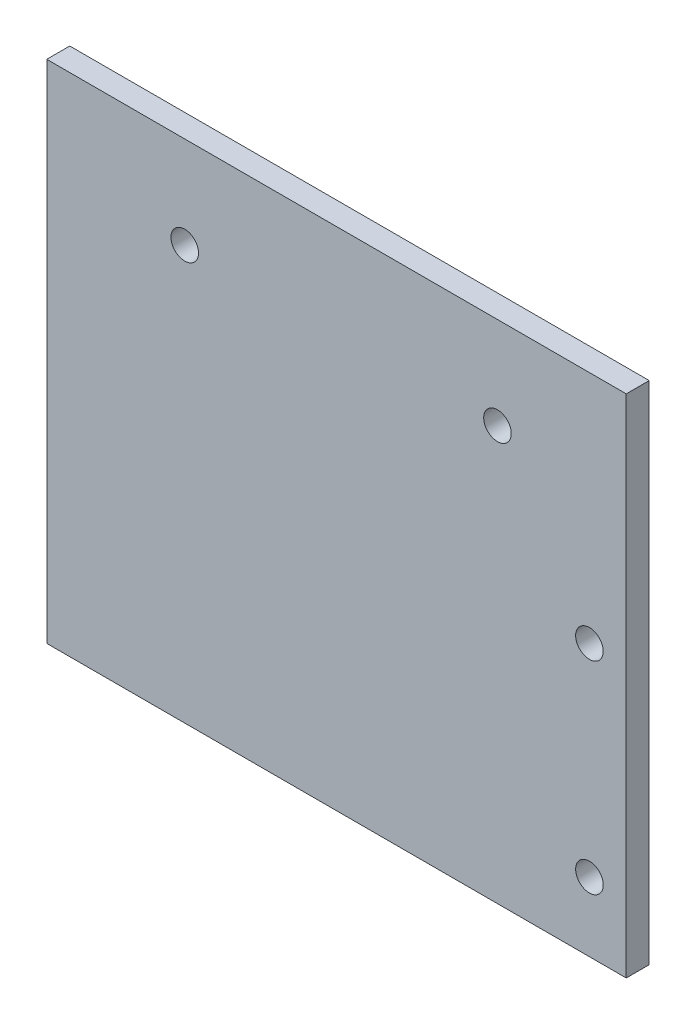
ISO-10303-21;
HEADER;
FILE_DESCRIPTION(('STEP AP214'),'2;1');
FILE_NAME('part.step','',(''),(''),'','','');
FILE_SCHEMA(('AUTOMOTIVE_DESIGN { 1 0 10303 214 1 1 1 1 }'));
ENDSEC;
DATA;
#1=APPLICATION_CONTEXT('core data for automotive mechanical design processes');
#2=APPLICATION_PROTOCOL_DEFINITION('international standard','automotive_design',2000,#1);
#3=PRODUCT_CONTEXT('',#1,'mechanical');
#4=PRODUCT('Part','Part','',(#3));
#5=PRODUCT_RELATED_PRODUCT_CATEGORY('part','',(#4));
#6=PRODUCT_DEFINITION_FORMATION('','',#4);
#7=PRODUCT_DEFINITION_CONTEXT('part definition',#1,'design');
#8=PRODUCT_DEFINITION('design','',#6,#7);
#9=PRODUCT_DEFINITION_SHAPE('','',#8);
#10=(LENGTH_UNIT() NAMED_UNIT(*) SI_UNIT(.MILLI.,.METRE.));
#11=(NAMED_UNIT(*) PLANE_ANGLE_UNIT() SI_UNIT($,.RADIAN.));
#12=(NAMED_UNIT(*) SI_UNIT($,.STERADIAN.) SOLID_ANGLE_UNIT());
#13=UNCERTAINTY_MEASURE_WITH_UNIT(LENGTH_MEASURE(1.E-05),#10,'distance_accuracy_value','');
#14=(GEOMETRIC_REPRESENTATION_CONTEXT(3) GLOBAL_UNCERTAINTY_ASSIGNED_CONTEXT((#13)) GLOBAL_UNIT_ASSIGNED_CONTEXT((#10,
#11,#12)) REPRESENTATION_CONTEXT('',''));
#15=CARTESIAN_POINT('',(0.,0.,0.));
#16=DIRECTION('',(0.,0.,1.));
#17=DIRECTION('',(1.,0.,0.));
#18=AXIS2_PLACEMENT_3D('',#15,#16,#17);
#19=CARTESIAN_POINT('',(0.,0.,2.5));
#20=DIRECTION('',(0.,0.,1.));
#21=DIRECTION('',(1.,0.,0.));
#22=AXIS2_PLACEMENT_3D('',#19,#20,#21);
#23=PLANE('',#22);
#24=CARTESIAN_POINT('',(77.5,-67.5,2.5));
#25=DIRECTION('',(0.,0.,-1.));
#26=DIRECTION('',(-1.,0.,0.));
#27=AXIS2_PLACEMENT_3D('',#24,#25,#26);
#28=CIRCLE('',#27,1.5);
#29=CARTESIAN_POINT('',(76.,-67.5,2.5));
#30=VERTEX_POINT('',#29);
#31=EDGE_CURVE('E123',#30,#30,#28,.T.);
#32=ORIENTED_EDGE('',*,*,#31,.T.);
#33=EDGE_LOOP('',(#32));
#34=FACE_BOUND('',#33,.T.);
#35=CARTESIAN_POINT('',(77.5,-45.5,2.5));
#36=DIRECTION('',(0.,0.,-1.));
#37=DIRECTION('',(-1.,0.,0.));
#38=AXIS2_PLACEMENT_3D('',#35,#36,#37);
#39=CIRCLE('',#38,1.5);
#40=CARTESIAN_POINT('',(76.,-45.5,2.5));
#41=VERTEX_POINT('',#40);
#42=EDGE_CURVE('E132',#41,#41,#39,.T.);
#43=ORIENTED_EDGE('',*,*,#42,.T.);
#44=EDGE_LOOP('',(#43));
#45=FACE_BOUND('',#44,.T.);
#46=CARTESIAN_POINT('',(67.5,-30.,2.5));
#47=DIRECTION('',(0.,0.,-1.));
#48=DIRECTION('',(-1.,0.,0.));
#49=AXIS2_PLACEMENT_3D('',#46,#47,#48);
#50=CIRCLE('',#49,1.5);
#51=CARTESIAN_POINT('',(66.,-30.,2.5));
#52=VERTEX_POINT('',#51);
#53=EDGE_CURVE('E140',#52,#52,#50,.T.);
#54=ORIENTED_EDGE('',*,*,#53,.T.);
#55=EDGE_LOOP('',(#54));
#56=FACE_BOUND('',#55,.T.);
#57=CARTESIAN_POINT('',(33.5,-30.,2.5));
#58=DIRECTION('',(0.,0.,-1.));
#59=DIRECTION('',(-1.,0.,0.));
#60=AXIS2_PLACEMENT_3D('',#57,#58,#59);
#61=CIRCLE('',#60,1.5);
#62=CARTESIAN_POINT('',(32.,-30.,2.5));
#63=VERTEX_POINT('',#62);
#64=EDGE_CURVE('E113',#63,#63,#61,.T.);
#65=ORIENTED_EDGE('',*,*,#64,.T.);
#66=EDGE_LOOP('',(#65));
#67=FACE_BOUND('',#66,.T.);
#68=DIRECTION('',(1.,0.,0.));
#69=VECTOR('',#68,1.);
#70=CARTESIAN_POINT('',(0.,-20.,2.5));
#71=LINE('',#70,#69);
#72=CARTESIAN_POINT('',(18.5,-20.,2.5));
#73=VERTEX_POINT('',#72);
#74=CARTESIAN_POINT('',(81.5,-20.,2.5));
#75=VERTEX_POINT('',#74);
#76=EDGE_CURVE('E60',#73,#75,#71,.T.);
#77=ORIENTED_EDGE('',*,*,#76,.F.);
#78=DIRECTION('',(0.,-1.,0.));
#79=VECTOR('',#78,1.);
#80=CARTESIAN_POINT('',(18.5,0.,2.5));
#81=LINE('',#80,#79);
#82=CARTESIAN_POINT('',(18.5,-75.,2.5));
#83=VERTEX_POINT('',#82);
#84=EDGE_CURVE('E128',#73,#83,#81,.T.);
#85=ORIENTED_EDGE('',*,*,#84,.T.);
#86=DIRECTION('',(1.,0.,0.));
#87=VECTOR('',#86,1.);
#88=CARTESIAN_POINT('',(-81.5,-75.,2.5));
#89=LINE('',#88,#87);
#90=CARTESIAN_POINT('',(81.5,-75.,2.5));
#91=VERTEX_POINT('',#90);
#92=EDGE_CURVE('E69',#83,#91,#89,.T.);
#93=ORIENTED_EDGE('',*,*,#92,.T.);
#94=DIRECTION('',(0.,-1.,0.));
#95=VECTOR('',#94,1.);
#96=CARTESIAN_POINT('',(81.5,75.,2.5));
#97=LINE('',#96,#95);
#98=EDGE_CURVE('E116',#75,#91,#97,.T.);
#99=ORIENTED_EDGE('',*,*,#98,.F.);
#100=EDGE_LOOP('',(#77,#85,#93,#99));
#101=FACE_BOUND('',#100,.T.);
#102=ADVANCED_FACE('F44',(#34,#45,#56,#67,#101),#23,.T.);
#103=CARTESIAN_POINT('',(0.,0.,0.));
#104=DIRECTION('',(0.,0.,1.));
#105=DIRECTION('',(1.,0.,0.));
#106=AXIS2_PLACEMENT_3D('',#103,#104,#105);
#107=PLANE('',#106);
#108=CARTESIAN_POINT('',(77.5,-67.5,0.));
#109=DIRECTION('',(0.,0.,-1.));
#110=DIRECTION('',(-1.,0.,0.));
#111=AXIS2_PLACEMENT_3D('',#108,#109,#110);
#112=CIRCLE('',#111,1.5);
#113=CARTESIAN_POINT('',(76.,-67.5,0.));
#114=VERTEX_POINT('',#113);
#115=EDGE_CURVE('E127',#114,#114,#112,.T.);
#116=ORIENTED_EDGE('',*,*,#115,.F.);
#117=EDGE_LOOP('',(#116));
#118=FACE_BOUND('',#117,.T.);
#119=CARTESIAN_POINT('',(77.5,-45.5,0.));
#120=DIRECTION('',(0.,0.,-1.));
#121=DIRECTION('',(-1.,0.,0.));
#122=AXIS2_PLACEMENT_3D('',#119,#120,#121);
#123=CIRCLE('',#122,1.5);
#124=CARTESIAN_POINT('',(76.,-45.5,0.));
#125=VERTEX_POINT('',#124);
#126=EDGE_CURVE('E136',#125,#125,#123,.T.);
#127=ORIENTED_EDGE('',*,*,#126,.F.);
#128=EDGE_LOOP('',(#127));
#129=FACE_BOUND('',#128,.T.);
#130=CARTESIAN_POINT('',(67.5,-30.,0.));
#131=DIRECTION('',(0.,0.,-1.));
#132=DIRECTION('',(-1.,0.,0.));
#133=AXIS2_PLACEMENT_3D('',#130,#131,#132);
#134=CIRCLE('',#133,1.5);
#135=CARTESIAN_POINT('',(66.,-30.,0.));
#136=VERTEX_POINT('',#135);
#137=EDGE_CURVE('E144',#136,#136,#134,.T.);
#138=ORIENTED_EDGE('',*,*,#137,.F.);
#139=EDGE_LOOP('',(#138));
#140=FACE_BOUND('',#139,.T.);
#141=CARTESIAN_POINT('',(33.5,-30.,0.));
#142=DIRECTION('',(0.,0.,-1.));
#143=DIRECTION('',(-1.,0.,0.));
#144=AXIS2_PLACEMENT_3D('',#141,#142,#143);
#145=CIRCLE('',#144,1.5);
#146=CARTESIAN_POINT('',(32.,-30.,0.));
#147=VERTEX_POINT('',#146);
#148=EDGE_CURVE('E107',#147,#147,#145,.T.);
#149=ORIENTED_EDGE('',*,*,#148,.F.);
#150=EDGE_LOOP('',(#149));
#151=FACE_BOUND('',#150,.T.);
#152=DIRECTION('',(0.,1.,0.));
#153=VECTOR('',#152,1.);
#154=CARTESIAN_POINT('',(18.5,0.,0.));
#155=LINE('',#154,#153);
#156=CARTESIAN_POINT('',(18.5,-75.,0.));
#157=VERTEX_POINT('',#156);
#158=CARTESIAN_POINT('',(18.5,-20.,0.));
#159=VERTEX_POINT('',#158);
#160=EDGE_CURVE('E87',#157,#159,#155,.T.);
#161=ORIENTED_EDGE('',*,*,#160,.T.);
#162=DIRECTION('',(-1.,0.,0.));
#163=VECTOR('',#162,1.);
#164=CARTESIAN_POINT('',(0.,-20.,0.));
#165=LINE('',#164,#163);
#166=CARTESIAN_POINT('',(81.5,-20.,0.));
#167=VERTEX_POINT('',#166);
#168=EDGE_CURVE('E96',#167,#159,#165,.T.);
#169=ORIENTED_EDGE('',*,*,#168,.F.);
#170=DIRECTION('',(0.,-1.,0.));
#171=VECTOR('',#170,1.);
#172=CARTESIAN_POINT('',(81.5,75.,0.));
#173=LINE('',#172,#171);
#174=CARTESIAN_POINT('',(81.5,-75.,0.));
#175=VERTEX_POINT('',#174);
#176=EDGE_CURVE('E104',#167,#175,#173,.T.);
#177=ORIENTED_EDGE('',*,*,#176,.T.);
#178=DIRECTION('',(1.,0.,0.));
#179=VECTOR('',#178,1.);
#180=CARTESIAN_POINT('',(-81.5,-75.,0.));
#181=LINE('',#180,#179);
#182=EDGE_CURVE('E100',#157,#175,#181,.T.);
#183=ORIENTED_EDGE('',*,*,#182,.F.);
#184=EDGE_LOOP('',(#161,#169,#177,#183));
#185=FACE_BOUND('',#184,.T.);
#186=ADVANCED_FACE('F102',(#118,#129,#140,#151,#185),#107,.F.);
#187=CARTESIAN_POINT('',(-81.5,-75.,2.5));
#188=DIRECTION('',(0.,1.,0.));
#189=DIRECTION('',(0.,0.,1.));
#190=AXIS2_PLACEMENT_3D('',#187,#188,#189);
#191=PLANE('',#190);
#192=DIRECTION('',(0.,0.,1.));
#193=VECTOR('',#192,1.);
#194=CARTESIAN_POINT('',(18.5,-75.,2.5));
#195=LINE('',#194,#193);
#196=EDGE_CURVE('E11',#157,#83,#195,.T.);
#197=ORIENTED_EDGE('',*,*,#196,.F.);
#198=ORIENTED_EDGE('',*,*,#182,.T.);
#199=DIRECTION('',(0.,0.,-1.));
#200=VECTOR('',#199,1.);
#201=CARTESIAN_POINT('',(81.5,-75.,2.5));
#202=LINE('',#201,#200);
#203=EDGE_CURVE('E53',#91,#175,#202,.T.);
#204=ORIENTED_EDGE('',*,*,#203,.F.);
#205=ORIENTED_EDGE('',*,*,#92,.F.);
#206=EDGE_LOOP('',(#197,#198,#204,#205));
#207=FACE_BOUND('',#206,.T.);
#208=ADVANCED_FACE('F46',(#207),#191,.F.);
#209=CARTESIAN_POINT('',(81.5,75.,2.5));
#210=DIRECTION('',(1.,0.,0.));
#211=DIRECTION('',(0.,1.,0.));
#212=AXIS2_PLACEMENT_3D('',#209,#210,#211);
#213=PLANE('',#212);
#214=DIRECTION('',(0.,0.,-1.));
#215=VECTOR('',#214,1.);
#216=CARTESIAN_POINT('',(81.5,-20.,10.));
#217=LINE('',#216,#215);
#218=EDGE_CURVE('E155',#75,#167,#217,.T.);
#219=ORIENTED_EDGE('',*,*,#218,.F.);
#220=ORIENTED_EDGE('',*,*,#98,.T.);
#221=ORIENTED_EDGE('',*,*,#203,.T.);
#222=ORIENTED_EDGE('',*,*,#176,.F.);
#223=EDGE_LOOP('',(#219,#220,#221,#222));
#224=FACE_BOUND('',#223,.T.);
#225=ADVANCED_FACE('F162',(#224),#213,.T.);
#226=CARTESIAN_POINT('',(77.5,-67.5,0.));
#227=DIRECTION('',(0.,0.,1.));
#228=DIRECTION('',(1.,0.,0.));
#229=AXIS2_PLACEMENT_3D('',#226,#227,#228);
#230=CYLINDRICAL_SURFACE('',#229,1.5);
#231=ORIENTED_EDGE('',*,*,#115,.T.);
#232=EDGE_LOOP('',(#231));
#233=FACE_BOUND('',#232,.T.);
#234=ORIENTED_EDGE('',*,*,#31,.F.);
#235=EDGE_LOOP('',(#234));
#236=FACE_BOUND('',#235,.T.);
#237=ADVANCED_FACE('F174',(#233,#236),#230,.F.);
#238=CARTESIAN_POINT('',(77.5,-45.5,0.));
#239=DIRECTION('',(0.,0.,1.));
#240=DIRECTION('',(1.,0.,0.));
#241=AXIS2_PLACEMENT_3D('',#238,#239,#240);
#242=CYLINDRICAL_SURFACE('',#241,1.5);
#243=ORIENTED_EDGE('',*,*,#126,.T.);
#244=EDGE_LOOP('',(#243));
#245=FACE_BOUND('',#244,.T.);
#246=ORIENTED_EDGE('',*,*,#42,.F.);
#247=EDGE_LOOP('',(#246));
#248=FACE_BOUND('',#247,.T.);
#249=ADVANCED_FACE('F182',(#245,#248),#242,.F.);
#250=CARTESIAN_POINT('',(67.5,-30.,0.));
#251=DIRECTION('',(0.,0.,1.));
#252=DIRECTION('',(1.,0.,0.));
#253=AXIS2_PLACEMENT_3D('',#250,#251,#252);
#254=CYLINDRICAL_SURFACE('',#253,1.5);
#255=ORIENTED_EDGE('',*,*,#137,.T.);
#256=EDGE_LOOP('',(#255));
#257=FACE_BOUND('',#256,.T.);
#258=ORIENTED_EDGE('',*,*,#53,.F.);
#259=EDGE_LOOP('',(#258));
#260=FACE_BOUND('',#259,.T.);
#261=ADVANCED_FACE('F217',(#257,#260),#254,.F.);
#262=CARTESIAN_POINT('',(33.5,-30.,0.));
#263=DIRECTION('',(0.,0.,1.));
#264=DIRECTION('',(1.,0.,0.));
#265=AXIS2_PLACEMENT_3D('',#262,#263,#264);
#266=CYLINDRICAL_SURFACE('',#265,1.5);
#267=ORIENTED_EDGE('',*,*,#148,.T.);
#268=EDGE_LOOP('',(#267));
#269=FACE_BOUND('',#268,.T.);
#270=ORIENTED_EDGE('',*,*,#64,.F.);
#271=EDGE_LOOP('',(#270));
#272=FACE_BOUND('',#271,.T.);
#273=ADVANCED_FACE('F203',(#269,#272),#266,.F.);
#274=CARTESIAN_POINT('',(18.5,0.,10.));
#275=DIRECTION('',(-1.,0.,0.));
#276=DIRECTION('',(0.,0.,1.));
#277=AXIS2_PLACEMENT_3D('',#274,#275,#276);
#278=PLANE('',#277);
#279=DIRECTION('',(0.,0.,-1.));
#280=VECTOR('',#279,1.);
#281=CARTESIAN_POINT('',(18.5,-20.,10.));
#282=LINE('',#281,#280);
#283=EDGE_CURVE('E90',#73,#159,#282,.T.);
#284=ORIENTED_EDGE('',*,*,#283,.T.);
#285=ORIENTED_EDGE('',*,*,#160,.F.);
#286=ORIENTED_EDGE('',*,*,#196,.T.);
#287=ORIENTED_EDGE('',*,*,#84,.F.);
#288=EDGE_LOOP('',(#284,#285,#286,#287));
#289=FACE_BOUND('',#288,.T.);
#290=ADVANCED_FACE('F89',(#289),#278,.T.);
#291=CARTESIAN_POINT('',(0.,-20.,10.));
#292=DIRECTION('',(0.,-1.,0.));
#293=DIRECTION('',(0.,0.,-1.));
#294=AXIS2_PLACEMENT_3D('',#291,#292,#293);
#295=PLANE('',#294);
#296=ORIENTED_EDGE('',*,*,#76,.T.);
#297=ORIENTED_EDGE('',*,*,#218,.T.);
#298=ORIENTED_EDGE('',*,*,#168,.T.);
#299=ORIENTED_EDGE('',*,*,#283,.F.);
#300=EDGE_LOOP('',(#296,#297,#298,#299));
#301=FACE_BOUND('',#300,.T.);
#302=ADVANCED_FACE('F161',(#301),#295,.F.);
#303=CLOSED_SHELL('',(#102,#186,#208,#225,#237,#249,#261,#273,#290,#302));
#304=MANIFOLD_SOLID_BREP('B2',#303);
#305=ADVANCED_BREP_SHAPE_REPRESENTATION('',(#18,#304),#14);
#306=SHAPE_DEFINITION_REPRESENTATION(#9,#305);
ENDSEC;
END-ISO-10303-21;
